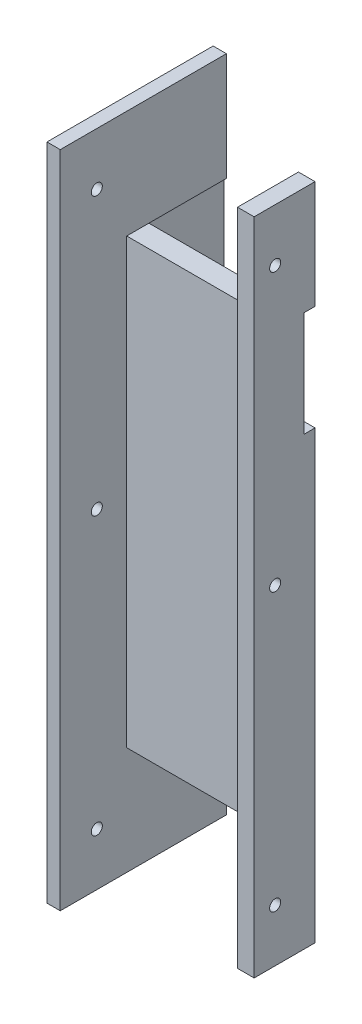
ISO-10303-21;
HEADER;
FILE_DESCRIPTION(('STEP AP214'),'2;1');
FILE_NAME('part.step','',(''),(''),'','','');
FILE_SCHEMA(('AUTOMOTIVE_DESIGN { 1 0 10303 214 1 1 1 1 }'));
ENDSEC;
DATA;
#1=APPLICATION_CONTEXT('core data for automotive mechanical design processes');
#2=APPLICATION_PROTOCOL_DEFINITION('international standard','automotive_design',2000,#1);
#3=PRODUCT_CONTEXT('',#1,'mechanical');
#4=PRODUCT('Part','Part','',(#3));
#5=PRODUCT_RELATED_PRODUCT_CATEGORY('part','',(#4));
#6=PRODUCT_DEFINITION_FORMATION('','',#4);
#7=PRODUCT_DEFINITION_CONTEXT('part definition',#1,'design');
#8=PRODUCT_DEFINITION('design','',#6,#7);
#9=PRODUCT_DEFINITION_SHAPE('','',#8);
#10=(LENGTH_UNIT() NAMED_UNIT(*) SI_UNIT(.MILLI.,.METRE.));
#11=(NAMED_UNIT(*) PLANE_ANGLE_UNIT() SI_UNIT($,.RADIAN.));
#12=(NAMED_UNIT(*) SI_UNIT($,.STERADIAN.) SOLID_ANGLE_UNIT());
#13=UNCERTAINTY_MEASURE_WITH_UNIT(LENGTH_MEASURE(1.E-05),#10,'distance_accuracy_value','');
#14=(GEOMETRIC_REPRESENTATION_CONTEXT(3) GLOBAL_UNCERTAINTY_ASSIGNED_CONTEXT((#13)) GLOBAL_UNIT_ASSIGNED_CONTEXT((#10,
#11,#12)) REPRESENTATION_CONTEXT('',''));
#15=CARTESIAN_POINT('',(0.,0.,0.));
#16=DIRECTION('',(0.,0.,1.));
#17=DIRECTION('',(1.,0.,0.));
#18=AXIS2_PLACEMENT_3D('',#15,#16,#17);
#19=CARTESIAN_POINT('',(1.5,-29.75,-1.50000000000001));
#20=DIRECTION('',(0.,0.,1.));
#21=DIRECTION('',(0.,-1.,0.));
#22=AXIS2_PLACEMENT_3D('',#19,#20,#21);
#23=PLANE('',#22);
#24=DIRECTION('',(0.,-1.,0.));
#25=VECTOR('',#24,1.);
#26=CARTESIAN_POINT('',(-12.5,-20.,-1.5));
#27=LINE('',#26,#25);
#28=CARTESIAN_POINT('',(-12.5,10.5,-1.5));
#29=VERTEX_POINT('',#28);
#30=CARTESIAN_POINT('',(-12.5,-20.,-1.5));
#31=VERTEX_POINT('',#30);
#32=EDGE_CURVE('E304',#29,#31,#27,.T.);
#33=ORIENTED_EDGE('',*,*,#32,.F.);
#34=DIRECTION('',(-1.,0.,0.));
#35=VECTOR('',#34,1.);
#36=CARTESIAN_POINT('',(-12.5,10.5,-1.5));
#37=LINE('',#36,#35);
#38=CARTESIAN_POINT('',(1.5,10.5,-1.5));
#39=VERTEX_POINT('',#38);
#40=EDGE_CURVE('E239',#39,#29,#37,.T.);
#41=ORIENTED_EDGE('',*,*,#40,.F.);
#42=DIRECTION('',(0.,1.,0.));
#43=VECTOR('',#42,1.);
#44=CARTESIAN_POINT('',(1.5,-29.75,-1.50000000000001));
#45=LINE('',#44,#43);
#46=CARTESIAN_POINT('',(1.5,-29.75,-1.50000000000001));
#47=VERTEX_POINT('',#46);
#48=EDGE_CURVE('E329',#47,#39,#45,.T.);
#49=ORIENTED_EDGE('',*,*,#48,.F.);
#50=DIRECTION('',(-1.,0.,0.));
#51=VECTOR('',#50,1.);
#52=CARTESIAN_POINT('',(1.5,-29.75,-1.50000000000001));
#53=LINE('',#52,#51);
#54=CARTESIAN_POINT('',(0.,-29.75,-1.50000000000001));
#55=VERTEX_POINT('',#54);
#56=EDGE_CURVE('E343',#47,#55,#53,.T.);
#57=ORIENTED_EDGE('',*,*,#56,.T.);
#58=DIRECTION('',(0.,1.,0.));
#59=VECTOR('',#58,1.);
#60=CARTESIAN_POINT('',(0.,-29.75,-1.50000000000001));
#61=LINE('',#60,#59);
#62=CARTESIAN_POINT('',(0.,-20.,-1.5));
#63=VERTEX_POINT('',#62);
#64=EDGE_CURVE('E344',#55,#63,#61,.T.);
#65=ORIENTED_EDGE('',*,*,#64,.T.);
#66=DIRECTION('',(1.,0.,0.));
#67=VECTOR('',#66,1.);
#68=CARTESIAN_POINT('',(-12.5,-20.,-1.5));
#69=LINE('',#68,#67);
#70=EDGE_CURVE('E321',#31,#63,#69,.T.);
#71=ORIENTED_EDGE('',*,*,#70,.F.);
#72=EDGE_LOOP('',(#33,#41,#49,#57,#65,#71));
#73=FACE_BOUND('',#72,.T.);
#74=ADVANCED_FACE('F47',(#73),#23,.F.);
#75=CARTESIAN_POINT('',(1.5,20.,-1.5));
#76=VERTEX_POINT('',#75);
#77=CARTESIAN_POINT('',(1.5,29.75,-1.49999999999999));
#78=VERTEX_POINT('',#77);
#79=EDGE_CURVE('E334',#76,#78,#45,.T.);
#80=ORIENTED_EDGE('',*,*,#79,.F.);
#81=DIRECTION('',(1.,0.,0.));
#82=VECTOR('',#81,1.);
#83=CARTESIAN_POINT('',(-12.5,20.,-1.5));
#84=LINE('',#83,#82);
#85=CARTESIAN_POINT('',(0.,20.,-1.5));
#86=VERTEX_POINT('',#85);
#87=EDGE_CURVE('E224',#86,#76,#84,.T.);
#88=ORIENTED_EDGE('',*,*,#87,.F.);
#89=CARTESIAN_POINT('',(0.,29.75,-1.49999999999999));
#90=VERTEX_POINT('',#89);
#91=EDGE_CURVE('E328',#86,#90,#61,.T.);
#92=ORIENTED_EDGE('',*,*,#91,.T.);
#93=DIRECTION('',(-1.,0.,0.));
#94=VECTOR('',#93,1.);
#95=CARTESIAN_POINT('',(1.5,29.75,-1.49999999999999));
#96=LINE('',#95,#94);
#97=EDGE_CURVE('E11',#78,#90,#96,.T.);
#98=ORIENTED_EDGE('',*,*,#97,.F.);
#99=EDGE_LOOP('',(#80,#88,#92,#98));
#100=FACE_BOUND('',#99,.T.);
#101=ADVANCED_FACE('F49',(#100),#23,.F.);
#102=CARTESIAN_POINT('',(1.5,29.75,4.00000000000001));
#103=DIRECTION('',(0.,-1.,0.));
#104=DIRECTION('',(0.,0.,-1.));
#105=AXIS2_PLACEMENT_3D('',#102,#103,#104);
#106=PLANE('',#105);
#107=DIRECTION('',(0.,0.,1.));
#108=VECTOR('',#107,1.);
#109=CARTESIAN_POINT('',(0.,29.75,4.00000000000001));
#110=LINE('',#109,#108);
#111=CARTESIAN_POINT('',(0.,29.75,4.00000000000001));
#112=VERTEX_POINT('',#111);
#113=EDGE_CURVE('E348',#90,#112,#110,.T.);
#114=ORIENTED_EDGE('',*,*,#113,.T.);
#115=DIRECTION('',(-1.,0.,0.));
#116=VECTOR('',#115,1.);
#117=CARTESIAN_POINT('',(1.5,29.75,4.00000000000001));
#118=LINE('',#117,#116);
#119=CARTESIAN_POINT('',(1.5,29.75,4.00000000000001));
#120=VERTEX_POINT('',#119);
#121=EDGE_CURVE('E57',#120,#112,#118,.T.);
#122=ORIENTED_EDGE('',*,*,#121,.F.);
#123=DIRECTION('',(0.,0.,1.));
#124=VECTOR('',#123,1.);
#125=CARTESIAN_POINT('',(1.5,29.75,4.00000000000001));
#126=LINE('',#125,#124);
#127=EDGE_CURVE('E333',#78,#120,#126,.T.);
#128=ORIENTED_EDGE('',*,*,#127,.F.);
#129=ORIENTED_EDGE('',*,*,#97,.T.);
#130=EDGE_LOOP('',(#114,#122,#128,#129));
#131=FACE_BOUND('',#130,.T.);
#132=ADVANCED_FACE('F448',(#131),#106,.F.);
#133=CARTESIAN_POINT('',(1.5,-29.75,3.99999999999999));
#134=DIRECTION('',(0.,0.,-1.));
#135=DIRECTION('',(0.,1.,0.));
#136=AXIS2_PLACEMENT_3D('',#133,#134,#135);
#137=PLANE('',#136);
#138=DIRECTION('',(0.,-1.,0.));
#139=VECTOR('',#138,1.);
#140=CARTESIAN_POINT('',(0.,-29.75,3.99999999999999));
#141=LINE('',#140,#139);
#142=CARTESIAN_POINT('',(0.,-29.75,3.99999999999999));
#143=VERTEX_POINT('',#142);
#144=EDGE_CURVE('E351',#112,#143,#141,.T.);
#145=ORIENTED_EDGE('',*,*,#144,.T.);
#146=DIRECTION('',(-1.,0.,0.));
#147=VECTOR('',#146,1.);
#148=CARTESIAN_POINT('',(1.5,-29.75,3.99999999999999));
#149=LINE('',#148,#147);
#150=CARTESIAN_POINT('',(1.5,-29.75,3.99999999999999));
#151=VERTEX_POINT('',#150);
#152=EDGE_CURVE('E360',#151,#143,#149,.T.);
#153=ORIENTED_EDGE('',*,*,#152,.F.);
#154=DIRECTION('',(0.,-1.,0.));
#155=VECTOR('',#154,1.);
#156=CARTESIAN_POINT('',(1.5,-29.75,3.99999999999999));
#157=LINE('',#156,#155);
#158=EDGE_CURVE('E337',#120,#151,#157,.T.);
#159=ORIENTED_EDGE('',*,*,#158,.F.);
#160=ORIENTED_EDGE('',*,*,#121,.T.);
#161=EDGE_LOOP('',(#145,#153,#159,#160));
#162=FACE_BOUND('',#161,.T.);
#163=ADVANCED_FACE('F716',(#162),#137,.F.);
#164=CARTESIAN_POINT('',(1.5,-29.75,3.99999999999999));
#165=DIRECTION('',(0.,1.,0.));
#166=DIRECTION('',(0.,0.,1.));
#167=AXIS2_PLACEMENT_3D('',#164,#165,#166);
#168=PLANE('',#167);
#169=DIRECTION('',(0.,0.,-1.));
#170=VECTOR('',#169,1.);
#171=CARTESIAN_POINT('',(0.,-29.75,3.99999999999999));
#172=LINE('',#171,#170);
#173=EDGE_CURVE('E354',#143,#55,#172,.T.);
#174=ORIENTED_EDGE('',*,*,#173,.T.);
#175=ORIENTED_EDGE('',*,*,#56,.F.);
#176=DIRECTION('',(0.,0.,-1.));
#177=VECTOR('',#176,1.);
#178=CARTESIAN_POINT('',(1.5,-29.75,3.99999999999999));
#179=LINE('',#178,#177);
#180=EDGE_CURVE('E340',#151,#47,#179,.T.);
#181=ORIENTED_EDGE('',*,*,#180,.F.);
#182=ORIENTED_EDGE('',*,*,#152,.T.);
#183=EDGE_LOOP('',(#174,#175,#181,#182));
#184=FACE_BOUND('',#183,.T.);
#185=ADVANCED_FACE('F709',(#184),#168,.F.);
#186=CARTESIAN_POINT('',(1.5,0.,0.));
#187=DIRECTION('',(-1.,0.,0.));
#188=DIRECTION('',(0.,0.,1.));
#189=AXIS2_PLACEMENT_3D('',#186,#187,#188);
#190=PLANE('',#189);
#191=CARTESIAN_POINT('',(1.5,-25.,2.09999999999999));
#192=DIRECTION('',(1.,0.,0.));
#193=DIRECTION('',(0.,0.,-1.));
#194=AXIS2_PLACEMENT_3D('',#191,#192,#193);
#195=CIRCLE('',#194,0.5);
#196=CARTESIAN_POINT('',(1.5,-25.,1.59999999999999));
#197=VERTEX_POINT('',#196);
#198=EDGE_CURVE('E371',#197,#197,#195,.T.);
#199=ORIENTED_EDGE('',*,*,#198,.F.);
#200=EDGE_LOOP('',(#199));
#201=FACE_BOUND('',#200,.T.);
#202=CARTESIAN_POINT('',(1.5,0.,2.10000000000007));
#203=DIRECTION('',(1.,0.,0.));
#204=DIRECTION('',(0.,0.,-1.));
#205=AXIS2_PLACEMENT_3D('',#202,#203,#204);
#206=CIRCLE('',#205,0.5);
#207=CARTESIAN_POINT('',(1.5,0.,1.60000000000007));
#208=VERTEX_POINT('',#207);
#209=EDGE_CURVE('E613',#208,#208,#206,.T.);
#210=ORIENTED_EDGE('',*,*,#209,.F.);
#211=EDGE_LOOP('',(#210));
#212=FACE_BOUND('',#211,.T.);
#213=CARTESIAN_POINT('',(1.5,25.,2.10000000000016));
#214=DIRECTION('',(1.,0.,0.));
#215=DIRECTION('',(0.,0.,-1.));
#216=AXIS2_PLACEMENT_3D('',#213,#214,#215);
#217=CIRCLE('',#216,0.5);
#218=CARTESIAN_POINT('',(1.5,25.,1.60000000000016));
#219=VERTEX_POINT('',#218);
#220=EDGE_CURVE('E621',#219,#219,#217,.T.);
#221=ORIENTED_EDGE('',*,*,#220,.F.);
#222=EDGE_LOOP('',(#221));
#223=FACE_BOUND('',#222,.T.);
#224=ORIENTED_EDGE('',*,*,#48,.T.);
#225=DIRECTION('',(0.,0.,-1.));
#226=VECTOR('',#225,1.);
#227=CARTESIAN_POINT('',(1.5,10.5,-0.499999999999997));
#228=LINE('',#227,#226);
#229=CARTESIAN_POINT('',(1.5,10.5,-0.499999999999997));
#230=VERTEX_POINT('',#229);
#231=EDGE_CURVE('E242',#230,#39,#228,.T.);
#232=ORIENTED_EDGE('',*,*,#231,.F.);
#233=DIRECTION('',(0.,-1.,0.));
#234=VECTOR('',#233,1.);
#235=CARTESIAN_POINT('',(1.5,20.,-0.499999999999996));
#236=LINE('',#235,#234);
#237=CARTESIAN_POINT('',(1.5,20.,-0.499999999999996));
#238=VERTEX_POINT('',#237);
#239=EDGE_CURVE('E183',#238,#230,#236,.T.);
#240=ORIENTED_EDGE('',*,*,#239,.F.);
#241=DIRECTION('',(0.,0.,-1.));
#242=VECTOR('',#241,1.);
#243=CARTESIAN_POINT('',(1.5,20.,-0.499999999999996));
#244=LINE('',#243,#242);
#245=EDGE_CURVE('E187',#238,#76,#244,.T.);
#246=ORIENTED_EDGE('',*,*,#245,.T.);
#247=ORIENTED_EDGE('',*,*,#79,.T.);
#248=ORIENTED_EDGE('',*,*,#127,.T.);
#249=ORIENTED_EDGE('',*,*,#158,.T.);
#250=ORIENTED_EDGE('',*,*,#180,.T.);
#251=EDGE_LOOP('',(#224,#232,#240,#246,#247,#248,#249,#250));
#252=FACE_BOUND('',#251,.T.);
#253=ADVANCED_FACE('F461',(#201,#212,#223,#252),#190,.F.);
#254=CARTESIAN_POINT('',(0.,0.,0.));
#255=DIRECTION('',(-1.,0.,0.));
#256=DIRECTION('',(0.,0.,1.));
#257=AXIS2_PLACEMENT_3D('',#254,#255,#256);
#258=PLANE('',#257);
#259=CARTESIAN_POINT('',(0.,-25.,2.09999999999999));
#260=DIRECTION('',(-1.,0.,0.));
#261=DIRECTION('',(0.,0.,1.));
#262=AXIS2_PLACEMENT_3D('',#259,#260,#261);
#263=CIRCLE('',#262,0.5);
#264=CARTESIAN_POINT('',(0.,-25.,2.59999999999999));
#265=VERTEX_POINT('',#264);
#266=EDGE_CURVE('E51',#265,#265,#263,.T.);
#267=ORIENTED_EDGE('',*,*,#266,.F.);
#268=EDGE_LOOP('',(#267));
#269=FACE_BOUND('',#268,.T.);
#270=CARTESIAN_POINT('',(0.,0.,2.10000000000007));
#271=DIRECTION('',(-1.,0.,0.));
#272=DIRECTION('',(0.,0.,1.));
#273=AXIS2_PLACEMENT_3D('',#270,#271,#272);
#274=CIRCLE('',#273,0.5);
#275=CARTESIAN_POINT('',(0.,0.,2.60000000000007));
#276=VERTEX_POINT('',#275);
#277=EDGE_CURVE('E370',#276,#276,#274,.T.);
#278=ORIENTED_EDGE('',*,*,#277,.F.);
#279=EDGE_LOOP('',(#278));
#280=FACE_BOUND('',#279,.T.);
#281=CARTESIAN_POINT('',(0.,25.,2.10000000000016));
#282=DIRECTION('',(-1.,0.,0.));
#283=DIRECTION('',(0.,0.,1.));
#284=AXIS2_PLACEMENT_3D('',#281,#282,#283);
#285=CIRCLE('',#284,0.5);
#286=CARTESIAN_POINT('',(0.,25.,2.60000000000016));
#287=VERTEX_POINT('',#286);
#288=EDGE_CURVE('E367',#287,#287,#285,.T.);
#289=ORIENTED_EDGE('',*,*,#288,.F.);
#290=EDGE_LOOP('',(#289));
#291=FACE_BOUND('',#290,.T.);
#292=DIRECTION('',(0.,0.,1.));
#293=VECTOR('',#292,1.);
#294=CARTESIAN_POINT('',(0.,-20.,-1.5));
#295=LINE('',#294,#293);
#296=CARTESIAN_POINT('',(0.,-20.,1.5));
#297=VERTEX_POINT('',#296);
#298=EDGE_CURVE('E300',#63,#297,#295,.T.);
#299=ORIENTED_EDGE('',*,*,#298,.F.);
#300=ORIENTED_EDGE('',*,*,#64,.F.);
#301=ORIENTED_EDGE('',*,*,#173,.F.);
#302=ORIENTED_EDGE('',*,*,#144,.F.);
#303=ORIENTED_EDGE('',*,*,#113,.F.);
#304=ORIENTED_EDGE('',*,*,#91,.F.);
#305=DIRECTION('',(0.,0.,-1.));
#306=VECTOR('',#305,1.);
#307=CARTESIAN_POINT('',(0.,20.,0.));
#308=LINE('',#307,#306);
#309=CARTESIAN_POINT('',(0.,20.,-0.499999999999996));
#310=VERTEX_POINT('',#309);
#311=EDGE_CURVE('E245',#310,#86,#308,.T.);
#312=ORIENTED_EDGE('',*,*,#311,.F.);
#313=DIRECTION('',(0.,0.,-1.));
#314=VECTOR('',#313,1.);
#315=CARTESIAN_POINT('',(0.,20.,-1.5));
#316=LINE('',#315,#314);
#317=CARTESIAN_POINT('',(0.,20.,1.5));
#318=VERTEX_POINT('',#317);
#319=EDGE_CURVE('E70',#318,#310,#316,.T.);
#320=ORIENTED_EDGE('',*,*,#319,.F.);
#321=DIRECTION('',(0.,1.,0.));
#322=VECTOR('',#321,1.);
#323=CARTESIAN_POINT('',(0.,-20.,1.5));
#324=LINE('',#323,#322);
#325=EDGE_CURVE('E65',#297,#318,#324,.T.);
#326=ORIENTED_EDGE('',*,*,#325,.F.);
#327=EDGE_LOOP('',(#299,#300,#301,#302,#303,#304,#312,#320,#326));
#328=FACE_BOUND('',#327,.T.);
#329=ADVANCED_FACE('F467',(#269,#280,#291,#328),#258,.T.);
#330=CARTESIAN_POINT('',(-12.5,-20.,1.5));
#331=DIRECTION('',(0.,0.,-1.));
#332=DIRECTION('',(-1.,0.,0.));
#333=AXIS2_PLACEMENT_3D('',#330,#331,#332);
#334=PLANE('',#333);
#335=ORIENTED_EDGE('',*,*,#325,.T.);
#336=DIRECTION('',(1.,0.,0.));
#337=VECTOR('',#336,1.);
#338=CARTESIAN_POINT('',(-12.5,20.,1.5));
#339=LINE('',#338,#337);
#340=CARTESIAN_POINT('',(-12.5,20.,1.5));
#341=VERTEX_POINT('',#340);
#342=EDGE_CURVE('E325',#341,#318,#339,.T.);
#343=ORIENTED_EDGE('',*,*,#342,.F.);
#344=DIRECTION('',(0.,1.,0.));
#345=VECTOR('',#344,1.);
#346=CARTESIAN_POINT('',(-12.5,-20.,1.5));
#347=LINE('',#346,#345);
#348=CARTESIAN_POINT('',(-12.5,-20.,1.5));
#349=VERTEX_POINT('',#348);
#350=EDGE_CURVE('E295',#349,#341,#347,.T.);
#351=ORIENTED_EDGE('',*,*,#350,.F.);
#352=DIRECTION('',(1.,0.,0.));
#353=VECTOR('',#352,1.);
#354=CARTESIAN_POINT('',(-12.5,-20.,1.5));
#355=LINE('',#354,#353);
#356=EDGE_CURVE('E311',#349,#297,#355,.T.);
#357=ORIENTED_EDGE('',*,*,#356,.T.);
#358=EDGE_LOOP('',(#335,#343,#351,#357));
#359=FACE_BOUND('',#358,.T.);
#360=ADVANCED_FACE('F473',(#359),#334,.F.);
#361=CARTESIAN_POINT('',(-12.5,20.,-1.5));
#362=DIRECTION('',(0.,-1.,0.));
#363=DIRECTION('',(0.,0.,-1.));
#364=AXIS2_PLACEMENT_3D('',#361,#362,#363);
#365=PLANE('',#364);
#366=ORIENTED_EDGE('',*,*,#319,.T.);
#367=DIRECTION('',(1.,0.,0.));
#368=VECTOR('',#367,1.);
#369=CARTESIAN_POINT('',(-12.5,20.,-0.499999999999996));
#370=LINE('',#369,#368);
#371=CARTESIAN_POINT('',(-12.5,20.,-0.499999999999996));
#372=VERTEX_POINT('',#371);
#373=EDGE_CURVE('E230',#372,#310,#370,.T.);
#374=ORIENTED_EDGE('',*,*,#373,.F.);
#375=DIRECTION('',(0.,0.,-1.));
#376=VECTOR('',#375,1.);
#377=CARTESIAN_POINT('',(-12.5,20.,-1.5));
#378=LINE('',#377,#376);
#379=EDGE_CURVE('E299',#341,#372,#378,.T.);
#380=ORIENTED_EDGE('',*,*,#379,.F.);
#381=ORIENTED_EDGE('',*,*,#342,.T.);
#382=EDGE_LOOP('',(#366,#374,#380,#381));
#383=FACE_BOUND('',#382,.T.);
#384=ADVANCED_FACE('F478',(#383),#365,.F.);
#385=CARTESIAN_POINT('',(-12.5,-20.,-1.5));
#386=DIRECTION('',(0.,1.,0.));
#387=DIRECTION('',(0.,0.,1.));
#388=AXIS2_PLACEMENT_3D('',#385,#386,#387);
#389=PLANE('',#388);
#390=ORIENTED_EDGE('',*,*,#298,.T.);
#391=ORIENTED_EDGE('',*,*,#356,.F.);
#392=DIRECTION('',(0.,0.,1.));
#393=VECTOR('',#392,1.);
#394=CARTESIAN_POINT('',(-12.5,-20.,-1.5));
#395=LINE('',#394,#393);
#396=EDGE_CURVE('E307',#31,#349,#395,.T.);
#397=ORIENTED_EDGE('',*,*,#396,.F.);
#398=ORIENTED_EDGE('',*,*,#70,.T.);
#399=EDGE_LOOP('',(#390,#391,#397,#398));
#400=FACE_BOUND('',#399,.T.);
#401=ADVANCED_FACE('F471',(#400),#389,.F.);
#402=CARTESIAN_POINT('',(-13.7,-29.75,7.5));
#403=DIRECTION('',(0.,0.,-1.));
#404=DIRECTION('',(-1.,0.,0.));
#405=AXIS2_PLACEMENT_3D('',#402,#403,#404);
#406=PLANE('',#405);
#407=DIRECTION('',(0.,1.,0.));
#408=VECTOR('',#407,1.);
#409=CARTESIAN_POINT('',(-12.5,-29.75,7.5));
#410=LINE('',#409,#408);
#411=CARTESIAN_POINT('',(-12.5,-29.75,7.5));
#412=VERTEX_POINT('',#411);
#413=CARTESIAN_POINT('',(-12.5,29.75,7.5));
#414=VERTEX_POINT('',#413);
#415=EDGE_CURVE('E251',#412,#414,#410,.T.);
#416=ORIENTED_EDGE('',*,*,#415,.T.);
#417=DIRECTION('',(1.,0.,0.));
#418=VECTOR('',#417,1.);
#419=CARTESIAN_POINT('',(-13.7,29.75,7.5));
#420=LINE('',#419,#418);
#421=CARTESIAN_POINT('',(-13.7,29.75,7.5));
#422=VERTEX_POINT('',#421);
#423=EDGE_CURVE('E291',#422,#414,#420,.T.);
#424=ORIENTED_EDGE('',*,*,#423,.F.);
#425=DIRECTION('',(0.,1.,0.));
#426=VECTOR('',#425,1.);
#427=CARTESIAN_POINT('',(-13.7,-29.75,7.5));
#428=LINE('',#427,#426);
#429=CARTESIAN_POINT('',(-13.7,-29.75,7.5));
#430=VERTEX_POINT('',#429);
#431=EDGE_CURVE('E252',#430,#422,#428,.T.);
#432=ORIENTED_EDGE('',*,*,#431,.F.);
#433=DIRECTION('',(1.,0.,0.));
#434=VECTOR('',#433,1.);
#435=CARTESIAN_POINT('',(-13.7,-29.75,7.5));
#436=LINE('',#435,#434);
#437=EDGE_CURVE('E266',#430,#412,#436,.T.);
#438=ORIENTED_EDGE('',*,*,#437,.T.);
#439=EDGE_LOOP('',(#416,#424,#432,#438));
#440=FACE_BOUND('',#439,.T.);
#441=ADVANCED_FACE('F667',(#440),#406,.F.);
#442=CARTESIAN_POINT('',(-13.7,29.75,-7.5));
#443=DIRECTION('',(0.,-1.,0.));
#444=DIRECTION('',(0.,0.,-1.));
#445=AXIS2_PLACEMENT_3D('',#442,#443,#444);
#446=PLANE('',#445);
#447=DIRECTION('',(0.,0.,-1.));
#448=VECTOR('',#447,1.);
#449=CARTESIAN_POINT('',(-12.5,29.75,-7.5));
#450=LINE('',#449,#448);
#451=CARTESIAN_POINT('',(-12.5,29.75,-7.5));
#452=VERTEX_POINT('',#451);
#453=EDGE_CURVE('E270',#414,#452,#450,.T.);
#454=ORIENTED_EDGE('',*,*,#453,.T.);
#455=DIRECTION('',(1.,0.,0.));
#456=VECTOR('',#455,1.);
#457=CARTESIAN_POINT('',(-13.7,29.75,-7.5));
#458=LINE('',#457,#456);
#459=CARTESIAN_POINT('',(-13.7,29.75,-7.5));
#460=VERTEX_POINT('',#459);
#461=EDGE_CURVE('E287',#460,#452,#458,.T.);
#462=ORIENTED_EDGE('',*,*,#461,.F.);
#463=DIRECTION('',(0.,0.,-1.));
#464=VECTOR('',#463,1.);
#465=CARTESIAN_POINT('',(-13.7,29.75,-7.5));
#466=LINE('',#465,#464);
#467=EDGE_CURVE('E256',#422,#460,#466,.T.);
#468=ORIENTED_EDGE('',*,*,#467,.F.);
#469=ORIENTED_EDGE('',*,*,#423,.T.);
#470=EDGE_LOOP('',(#454,#462,#468,#469));
#471=FACE_BOUND('',#470,.T.);
#472=ADVANCED_FACE('F670',(#471),#446,.F.);
#473=CARTESIAN_POINT('',(-13.7,-29.75,-7.5));
#474=DIRECTION('',(0.,0.,1.));
#475=DIRECTION('',(1.,0.,0.));
#476=AXIS2_PLACEMENT_3D('',#473,#474,#475);
#477=PLANE('',#476);
#478=DIRECTION('',(0.,-1.,0.));
#479=VECTOR('',#478,1.);
#480=CARTESIAN_POINT('',(-12.5,-29.75,-7.5));
#481=LINE('',#480,#479);
#482=CARTESIAN_POINT('',(-12.5,20.,-7.5));
#483=VERTEX_POINT('',#482);
#484=EDGE_CURVE('E274',#452,#483,#481,.T.);
#485=ORIENTED_EDGE('',*,*,#484,.T.);
#486=DIRECTION('',(1.,0.,0.));
#487=VECTOR('',#486,1.);
#488=CARTESIAN_POINT('',(-12.7,20.,-7.5));
#489=LINE('',#488,#487);
#490=CARTESIAN_POINT('',(-12.7,20.,-7.5));
#491=VERTEX_POINT('',#490);
#492=EDGE_CURVE('E225',#491,#483,#489,.T.);
#493=ORIENTED_EDGE('',*,*,#492,.F.);
#494=DIRECTION('',(0.,1.,0.));
#495=VECTOR('',#494,1.);
#496=CARTESIAN_POINT('',(-12.7,10.5,-7.5));
#497=LINE('',#496,#495);
#498=CARTESIAN_POINT('',(-12.7,10.5,-7.5));
#499=VERTEX_POINT('',#498);
#500=EDGE_CURVE('E198',#499,#491,#497,.T.);
#501=ORIENTED_EDGE('',*,*,#500,.F.);
#502=DIRECTION('',(1.,0.,0.));
#503=VECTOR('',#502,1.);
#504=CARTESIAN_POINT('',(-12.7,10.5,-7.5));
#505=LINE('',#504,#503);
#506=CARTESIAN_POINT('',(-12.5,10.5,-7.5));
#507=VERTEX_POINT('',#506);
#508=EDGE_CURVE('E194',#499,#507,#505,.T.);
#509=ORIENTED_EDGE('',*,*,#508,.T.);
#510=CARTESIAN_POINT('',(-12.5,-29.75,-7.5));
#511=VERTEX_POINT('',#510);
#512=EDGE_CURVE('E273',#507,#511,#481,.T.);
#513=ORIENTED_EDGE('',*,*,#512,.T.);
#514=DIRECTION('',(1.,0.,0.));
#515=VECTOR('',#514,1.);
#516=CARTESIAN_POINT('',(-13.7,-29.75,-7.5));
#517=LINE('',#516,#515);
#518=CARTESIAN_POINT('',(-13.7,-29.75,-7.5));
#519=VERTEX_POINT('',#518);
#520=EDGE_CURVE('E283',#519,#511,#517,.T.);
#521=ORIENTED_EDGE('',*,*,#520,.F.);
#522=DIRECTION('',(0.,-1.,0.));
#523=VECTOR('',#522,1.);
#524=CARTESIAN_POINT('',(-13.7,-29.75,-7.5));
#525=LINE('',#524,#523);
#526=EDGE_CURVE('E260',#460,#519,#525,.T.);
#527=ORIENTED_EDGE('',*,*,#526,.F.);
#528=ORIENTED_EDGE('',*,*,#461,.T.);
#529=EDGE_LOOP('',(#485,#493,#501,#509,#513,#521,#527,#528));
#530=FACE_BOUND('',#529,.T.);
#531=ADVANCED_FACE('F674',(#530),#477,.F.);
#532=CARTESIAN_POINT('',(-13.7,-29.75,-7.5));
#533=DIRECTION('',(0.,1.,0.));
#534=DIRECTION('',(0.,0.,1.));
#535=AXIS2_PLACEMENT_3D('',#532,#533,#534);
#536=PLANE('',#535);
#537=DIRECTION('',(0.,0.,1.));
#538=VECTOR('',#537,1.);
#539=CARTESIAN_POINT('',(-12.5,-29.75,-7.5));
#540=LINE('',#539,#538);
#541=EDGE_CURVE('E257',#511,#412,#540,.T.);
#542=ORIENTED_EDGE('',*,*,#541,.T.);
#543=ORIENTED_EDGE('',*,*,#437,.F.);
#544=DIRECTION('',(0.,0.,1.));
#545=VECTOR('',#544,1.);
#546=CARTESIAN_POINT('',(-13.7,-29.75,-7.5));
#547=LINE('',#546,#545);
#548=EDGE_CURVE('E263',#519,#430,#547,.T.);
#549=ORIENTED_EDGE('',*,*,#548,.F.);
#550=ORIENTED_EDGE('',*,*,#520,.T.);
#551=EDGE_LOOP('',(#542,#543,#549,#550));
#552=FACE_BOUND('',#551,.T.);
#553=ADVANCED_FACE('F657',(#552),#536,.F.);
#554=CARTESIAN_POINT('',(-13.7,0.,0.));
#555=DIRECTION('',(1.,0.,0.));
#556=DIRECTION('',(0.,0.,-1.));
#557=AXIS2_PLACEMENT_3D('',#554,#555,#556);
#558=PLANE('',#557);
#559=CARTESIAN_POINT('',(-13.7,-25.,4.2));
#560=DIRECTION('',(1.,0.,0.));
#561=DIRECTION('',(0.,0.,-1.));
#562=AXIS2_PLACEMENT_3D('',#559,#560,#561);
#563=CIRCLE('',#562,0.500000000000001);
#564=CARTESIAN_POINT('',(-13.7,-25.,3.7));
#565=VERTEX_POINT('',#564);
#566=EDGE_CURVE('E212',#565,#565,#563,.T.);
#567=ORIENTED_EDGE('',*,*,#566,.T.);
#568=EDGE_LOOP('',(#567));
#569=FACE_BOUND('',#568,.T.);
#570=CARTESIAN_POINT('',(-13.7,-16.5,-3.8));
#571=DIRECTION('',(1.,0.,0.));
#572=DIRECTION('',(0.,0.,-1.));
#573=AXIS2_PLACEMENT_3D('',#570,#571,#572);
#574=CIRCLE('',#573,0.500000000000001);
#575=CARTESIAN_POINT('',(-13.7,-16.5,-4.3));
#576=VERTEX_POINT('',#575);
#577=EDGE_CURVE('E411',#576,#576,#574,.T.);
#578=ORIENTED_EDGE('',*,*,#577,.T.);
#579=EDGE_LOOP('',(#578));
#580=FACE_BOUND('',#579,.T.);
#581=CARTESIAN_POINT('',(-13.7,0.,4.20000000000009));
#582=DIRECTION('',(1.,0.,0.));
#583=DIRECTION('',(0.,0.,-1.));
#584=AXIS2_PLACEMENT_3D('',#581,#582,#583);
#585=CIRCLE('',#584,0.500000000000001);
#586=CARTESIAN_POINT('',(-13.7,0.,3.70000000000008));
#587=VERTEX_POINT('',#586);
#588=EDGE_CURVE('E408',#587,#587,#585,.T.);
#589=ORIENTED_EDGE('',*,*,#588,.T.);
#590=EDGE_LOOP('',(#589));
#591=FACE_BOUND('',#590,.T.);
#592=CARTESIAN_POINT('',(-13.7,25.,4.20000000000017));
#593=DIRECTION('',(1.,0.,0.));
#594=DIRECTION('',(0.,0.,-1.));
#595=AXIS2_PLACEMENT_3D('',#592,#593,#594);
#596=CIRCLE('',#595,0.500000000000001);
#597=CARTESIAN_POINT('',(-13.7,25.,3.70000000000017));
#598=VERTEX_POINT('',#597);
#599=EDGE_CURVE('E403',#598,#598,#596,.T.);
#600=ORIENTED_EDGE('',*,*,#599,.T.);
#601=EDGE_LOOP('',(#600));
#602=FACE_BOUND('',#601,.T.);
#603=CARTESIAN_POINT('',(-13.7,7.5,-3.79999999999992));
#604=DIRECTION('',(1.,0.,0.));
#605=DIRECTION('',(0.,0.,-1.));
#606=AXIS2_PLACEMENT_3D('',#603,#604,#605);
#607=CIRCLE('',#606,0.500000000000001);
#608=CARTESIAN_POINT('',(-13.7,7.5,-4.29999999999992));
#609=VERTEX_POINT('',#608);
#610=EDGE_CURVE('E399',#609,#609,#607,.T.);
#611=ORIENTED_EDGE('',*,*,#610,.T.);
#612=EDGE_LOOP('',(#611));
#613=FACE_BOUND('',#612,.T.);
#614=ORIENTED_EDGE('',*,*,#431,.T.);
#615=ORIENTED_EDGE('',*,*,#467,.T.);
#616=ORIENTED_EDGE('',*,*,#526,.T.);
#617=ORIENTED_EDGE('',*,*,#548,.T.);
#618=EDGE_LOOP('',(#614,#615,#616,#617));
#619=FACE_BOUND('',#618,.T.);
#620=ADVANCED_FACE('F424',(#569,#580,#591,#602,#613,#619),#558,.F.);
#621=CARTESIAN_POINT('',(-12.5,0.,0.));
#622=DIRECTION('',(1.,0.,0.));
#623=DIRECTION('',(0.,0.,-1.));
#624=AXIS2_PLACEMENT_3D('',#621,#622,#623);
#625=PLANE('',#624);
#626=CARTESIAN_POINT('',(-12.5,-25.,4.2));
#627=DIRECTION('',(1.,0.,0.));
#628=DIRECTION('',(0.,0.,-1.));
#629=AXIS2_PLACEMENT_3D('',#626,#627,#628);
#630=CIRCLE('',#629,0.500000000000001);
#631=CARTESIAN_POINT('',(-12.5,-25.,3.7));
#632=VERTEX_POINT('',#631);
#633=EDGE_CURVE('E404',#632,#632,#630,.T.);
#634=ORIENTED_EDGE('',*,*,#633,.F.);
#635=EDGE_LOOP('',(#634));
#636=FACE_BOUND('',#635,.T.);
#637=CARTESIAN_POINT('',(-12.5,-16.5,-3.8));
#638=DIRECTION('',(1.,0.,0.));
#639=DIRECTION('',(0.,0.,-1.));
#640=AXIS2_PLACEMENT_3D('',#637,#638,#639);
#641=CIRCLE('',#640,0.500000000000001);
#642=CARTESIAN_POINT('',(-12.5,-16.5,-4.3));
#643=VERTEX_POINT('',#642);
#644=EDGE_CURVE('E631',#643,#643,#641,.T.);
#645=ORIENTED_EDGE('',*,*,#644,.F.);
#646=EDGE_LOOP('',(#645));
#647=FACE_BOUND('',#646,.T.);
#648=CARTESIAN_POINT('',(-12.5,0.,4.20000000000009));
#649=DIRECTION('',(1.,0.,0.));
#650=DIRECTION('',(0.,0.,-1.));
#651=AXIS2_PLACEMENT_3D('',#648,#649,#650);
#652=CIRCLE('',#651,0.500000000000001);
#653=CARTESIAN_POINT('',(-12.5,0.,3.70000000000008));
#654=VERTEX_POINT('',#653);
#655=EDGE_CURVE('E395',#654,#654,#652,.T.);
#656=ORIENTED_EDGE('',*,*,#655,.F.);
#657=EDGE_LOOP('',(#656));
#658=FACE_BOUND('',#657,.T.);
#659=CARTESIAN_POINT('',(-12.5,25.,4.20000000000017));
#660=DIRECTION('',(1.,0.,0.));
#661=DIRECTION('',(0.,0.,-1.));
#662=AXIS2_PLACEMENT_3D('',#659,#660,#661);
#663=CIRCLE('',#662,0.500000000000001);
#664=CARTESIAN_POINT('',(-12.5,25.,3.70000000000017));
#665=VERTEX_POINT('',#664);
#666=EDGE_CURVE('E387',#665,#665,#663,.T.);
#667=ORIENTED_EDGE('',*,*,#666,.F.);
#668=EDGE_LOOP('',(#667));
#669=FACE_BOUND('',#668,.T.);
#670=CARTESIAN_POINT('',(-12.5,7.5,-3.79999999999992));
#671=DIRECTION('',(1.,0.,0.));
#672=DIRECTION('',(0.,0.,-1.));
#673=AXIS2_PLACEMENT_3D('',#670,#671,#672);
#674=CIRCLE('',#673,0.500000000000001);
#675=CARTESIAN_POINT('',(-12.5,7.5,-4.29999999999992));
#676=VERTEX_POINT('',#675);
#677=EDGE_CURVE('E380',#676,#676,#674,.T.);
#678=ORIENTED_EDGE('',*,*,#677,.F.);
#679=EDGE_LOOP('',(#678));
#680=FACE_BOUND('',#679,.T.);
#681=DIRECTION('',(0.,0.,1.));
#682=VECTOR('',#681,1.);
#683=CARTESIAN_POINT('',(-12.5,20.,-0.499999999999997));
#684=LINE('',#683,#682);
#685=EDGE_CURVE('E204',#483,#372,#684,.T.);
#686=ORIENTED_EDGE('',*,*,#685,.F.);
#687=ORIENTED_EDGE('',*,*,#484,.F.);
#688=ORIENTED_EDGE('',*,*,#453,.F.);
#689=ORIENTED_EDGE('',*,*,#415,.F.);
#690=ORIENTED_EDGE('',*,*,#541,.F.);
#691=ORIENTED_EDGE('',*,*,#512,.F.);
#692=DIRECTION('',(0.,0.,-1.));
#693=VECTOR('',#692,1.);
#694=CARTESIAN_POINT('',(-12.5,10.5,-0.499999999999997));
#695=LINE('',#694,#693);
#696=EDGE_CURVE('E209',#29,#507,#695,.T.);
#697=ORIENTED_EDGE('',*,*,#696,.F.);
#698=ORIENTED_EDGE('',*,*,#32,.T.);
#699=ORIENTED_EDGE('',*,*,#396,.T.);
#700=ORIENTED_EDGE('',*,*,#350,.T.);
#701=ORIENTED_EDGE('',*,*,#379,.T.);
#702=EDGE_LOOP('',(#686,#687,#688,#689,#690,#691,#697,#698,#699,#700,#701));
#703=FACE_BOUND('',#702,.T.);
#704=ADVANCED_FACE('F457',(#636,#647,#658,#669,#680,#703),#625,.T.);
#705=CARTESIAN_POINT('',(-12.5,10.5,-0.499999999999997));
#706=DIRECTION('',(0.,-1.,0.));
#707=DIRECTION('',(0.,0.,-1.));
#708=AXIS2_PLACEMENT_3D('',#705,#706,#707);
#709=PLANE('',#708);
#710=ORIENTED_EDGE('',*,*,#40,.T.);
#711=ORIENTED_EDGE('',*,*,#696,.T.);
#712=ORIENTED_EDGE('',*,*,#508,.F.);
#713=DIRECTION('',(0.,0.,-1.));
#714=VECTOR('',#713,1.);
#715=CARTESIAN_POINT('',(-12.7,10.5,-0.499999999999997));
#716=LINE('',#715,#714);
#717=CARTESIAN_POINT('',(-12.7,10.5,-0.499999999999997));
#718=VERTEX_POINT('',#717);
#719=EDGE_CURVE('E190',#718,#499,#716,.T.);
#720=ORIENTED_EDGE('',*,*,#719,.F.);
#721=DIRECTION('',(-1.,0.,0.));
#722=VECTOR('',#721,1.);
#723=CARTESIAN_POINT('',(-12.5,10.5,-0.499999999999997));
#724=LINE('',#723,#722);
#725=EDGE_CURVE('E175',#230,#718,#724,.T.);
#726=ORIENTED_EDGE('',*,*,#725,.F.);
#727=ORIENTED_EDGE('',*,*,#231,.T.);
#728=EDGE_LOOP('',(#710,#711,#712,#720,#726,#727));
#729=FACE_BOUND('',#728,.T.);
#730=ADVANCED_FACE('F192',(#729),#709,.F.);
#731=CARTESIAN_POINT('',(-12.5,20.,-0.499999999999996));
#732=DIRECTION('',(0.,1.,0.));
#733=DIRECTION('',(0.,0.,1.));
#734=AXIS2_PLACEMENT_3D('',#731,#732,#733);
#735=PLANE('',#734);
#736=ORIENTED_EDGE('',*,*,#311,.T.);
#737=ORIENTED_EDGE('',*,*,#87,.T.);
#738=ORIENTED_EDGE('',*,*,#245,.F.);
#739=EDGE_CURVE('E234',#310,#238,#370,.T.);
#740=ORIENTED_EDGE('',*,*,#739,.F.);
#741=EDGE_LOOP('',(#736,#737,#738,#740));
#742=FACE_BOUND('',#741,.T.);
#743=ADVANCED_FACE('F484',(#742),#735,.F.);
#744=CARTESIAN_POINT('',(0.,0.,-0.499999999999999));
#745=DIRECTION('',(0.,0.,1.));
#746=DIRECTION('',(0.,-1.,0.));
#747=AXIS2_PLACEMENT_3D('',#744,#745,#746);
#748=PLANE('',#747);
#749=ORIENTED_EDGE('',*,*,#725,.T.);
#750=DIRECTION('',(0.,-1.,0.));
#751=VECTOR('',#750,1.);
#752=CARTESIAN_POINT('',(-12.7,10.5,-0.499999999999997));
#753=LINE('',#752,#751);
#754=CARTESIAN_POINT('',(-12.7,20.,-0.499999999999997));
#755=VERTEX_POINT('',#754);
#756=EDGE_CURVE('E180',#755,#718,#753,.T.);
#757=ORIENTED_EDGE('',*,*,#756,.F.);
#758=DIRECTION('',(1.,0.,0.));
#759=VECTOR('',#758,1.);
#760=CARTESIAN_POINT('',(-12.7,20.,-0.499999999999997));
#761=LINE('',#760,#759);
#762=EDGE_CURVE('E221',#755,#372,#761,.T.);
#763=ORIENTED_EDGE('',*,*,#762,.T.);
#764=ORIENTED_EDGE('',*,*,#373,.T.);
#765=ORIENTED_EDGE('',*,*,#739,.T.);
#766=ORIENTED_EDGE('',*,*,#239,.T.);
#767=EDGE_LOOP('',(#749,#757,#763,#764,#765,#766));
#768=FACE_BOUND('',#767,.T.);
#769=ADVANCED_FACE('F177',(#768),#748,.F.);
#770=CARTESIAN_POINT('',(-12.7,20.,-0.499999999999997));
#771=DIRECTION('',(0.,1.,0.));
#772=DIRECTION('',(0.,0.,1.));
#773=AXIS2_PLACEMENT_3D('',#770,#771,#772);
#774=PLANE('',#773);
#775=ORIENTED_EDGE('',*,*,#685,.T.);
#776=ORIENTED_EDGE('',*,*,#762,.F.);
#777=DIRECTION('',(0.,0.,1.));
#778=VECTOR('',#777,1.);
#779=CARTESIAN_POINT('',(-12.7,20.,-0.499999999999997));
#780=LINE('',#779,#778);
#781=EDGE_CURVE('E202',#491,#755,#780,.T.);
#782=ORIENTED_EDGE('',*,*,#781,.F.);
#783=ORIENTED_EDGE('',*,*,#492,.T.);
#784=EDGE_LOOP('',(#775,#776,#782,#783));
#785=FACE_BOUND('',#784,.T.);
#786=ADVANCED_FACE('F678',(#785),#774,.F.);
#787=CARTESIAN_POINT('',(-12.7,0.,0.));
#788=DIRECTION('',(-1.,0.,0.));
#789=DIRECTION('',(0.,0.,1.));
#790=AXIS2_PLACEMENT_3D('',#787,#788,#789);
#791=PLANE('',#790);
#792=ORIENTED_EDGE('',*,*,#756,.T.);
#793=ORIENTED_EDGE('',*,*,#719,.T.);
#794=ORIENTED_EDGE('',*,*,#500,.T.);
#795=ORIENTED_EDGE('',*,*,#781,.T.);
#796=EDGE_LOOP('',(#792,#793,#794,#795));
#797=FACE_BOUND('',#796,.T.);
#798=ADVANCED_FACE('F200',(#797),#791,.F.);
#799=CARTESIAN_POINT('',(-14.7,7.5,-3.79999999999992));
#800=DIRECTION('',(1.,0.,0.));
#801=DIRECTION('',(0.,0.,-1.));
#802=AXIS2_PLACEMENT_3D('',#799,#800,#801);
#803=CYLINDRICAL_SURFACE('',#802,0.500000000000001);
#804=ORIENTED_EDGE('',*,*,#677,.T.);
#805=EDGE_LOOP('',(#804));
#806=FACE_BOUND('',#805,.T.);
#807=ORIENTED_EDGE('',*,*,#610,.F.);
#808=EDGE_LOOP('',(#807));
#809=FACE_BOUND('',#808,.T.);
#810=ADVANCED_FACE('F651',(#806,#809),#803,.F.);
#811=CARTESIAN_POINT('',(-14.7,25.,4.20000000000017));
#812=DIRECTION('',(1.,0.,0.));
#813=DIRECTION('',(0.,0.,-1.));
#814=AXIS2_PLACEMENT_3D('',#811,#812,#813);
#815=CYLINDRICAL_SURFACE('',#814,0.500000000000001);
#816=ORIENTED_EDGE('',*,*,#666,.T.);
#817=EDGE_LOOP('',(#816));
#818=FACE_BOUND('',#817,.T.);
#819=ORIENTED_EDGE('',*,*,#599,.F.);
#820=EDGE_LOOP('',(#819));
#821=FACE_BOUND('',#820,.T.);
#822=ADVANCED_FACE('F648',(#818,#821),#815,.F.);
#823=CARTESIAN_POINT('',(-14.7,0.,4.20000000000009));
#824=DIRECTION('',(1.,0.,0.));
#825=DIRECTION('',(0.,0.,-1.));
#826=AXIS2_PLACEMENT_3D('',#823,#824,#825);
#827=CYLINDRICAL_SURFACE('',#826,0.500000000000001);
#828=ORIENTED_EDGE('',*,*,#655,.T.);
#829=EDGE_LOOP('',(#828));
#830=FACE_BOUND('',#829,.T.);
#831=ORIENTED_EDGE('',*,*,#588,.F.);
#832=EDGE_LOOP('',(#831));
#833=FACE_BOUND('',#832,.T.);
#834=ADVANCED_FACE('F439',(#830,#833),#827,.F.);
#835=CARTESIAN_POINT('',(-14.7,-16.5,-3.8));
#836=DIRECTION('',(1.,0.,0.));
#837=DIRECTION('',(0.,0.,-1.));
#838=AXIS2_PLACEMENT_3D('',#835,#836,#837);
#839=CYLINDRICAL_SURFACE('',#838,0.500000000000001);
#840=ORIENTED_EDGE('',*,*,#644,.T.);
#841=EDGE_LOOP('',(#840));
#842=FACE_BOUND('',#841,.T.);
#843=ORIENTED_EDGE('',*,*,#577,.F.);
#844=EDGE_LOOP('',(#843));
#845=FACE_BOUND('',#844,.T.);
#846=ADVANCED_FACE('F429',(#842,#845),#839,.F.);
#847=CARTESIAN_POINT('',(-14.7,-25.,4.2));
#848=DIRECTION('',(1.,0.,0.));
#849=DIRECTION('',(0.,0.,-1.));
#850=AXIS2_PLACEMENT_3D('',#847,#848,#849);
#851=CYLINDRICAL_SURFACE('',#850,0.500000000000001);
#852=ORIENTED_EDGE('',*,*,#633,.T.);
#853=EDGE_LOOP('',(#852));
#854=FACE_BOUND('',#853,.T.);
#855=ORIENTED_EDGE('',*,*,#566,.F.);
#856=EDGE_LOOP('',(#855));
#857=FACE_BOUND('',#856,.T.);
#858=ADVANCED_FACE('F426',(#854,#857),#851,.F.);
#859=CARTESIAN_POINT('',(-2.5,25.,2.10000000000016));
#860=DIRECTION('',(1.,0.,0.));
#861=DIRECTION('',(0.,0.,-1.));
#862=AXIS2_PLACEMENT_3D('',#859,#860,#861);
#863=CYLINDRICAL_SURFACE('',#862,0.5);
#864=ORIENTED_EDGE('',*,*,#288,.T.);
#865=EDGE_LOOP('',(#864));
#866=FACE_BOUND('',#865,.T.);
#867=ORIENTED_EDGE('',*,*,#220,.T.);
#868=EDGE_LOOP('',(#867));
#869=FACE_BOUND('',#868,.T.);
#870=ADVANCED_FACE('F428',(#866,#869),#863,.F.);
#871=CARTESIAN_POINT('',(-2.5,0.,2.10000000000007));
#872=DIRECTION('',(1.,0.,0.));
#873=DIRECTION('',(0.,0.,-1.));
#874=AXIS2_PLACEMENT_3D('',#871,#872,#873);
#875=CYLINDRICAL_SURFACE('',#874,0.5);
#876=ORIENTED_EDGE('',*,*,#277,.T.);
#877=EDGE_LOOP('',(#876));
#878=FACE_BOUND('',#877,.T.);
#879=ORIENTED_EDGE('',*,*,#209,.T.);
#880=EDGE_LOOP('',(#879));
#881=FACE_BOUND('',#880,.T.);
#882=ADVANCED_FACE('F436',(#878,#881),#875,.F.);
#883=CARTESIAN_POINT('',(-2.5,-25.,2.09999999999999));
#884=DIRECTION('',(1.,0.,0.));
#885=DIRECTION('',(0.,0.,-1.));
#886=AXIS2_PLACEMENT_3D('',#883,#884,#885);
#887=CYLINDRICAL_SURFACE('',#886,0.5);
#888=ORIENTED_EDGE('',*,*,#266,.T.);
#889=EDGE_LOOP('',(#888));
#890=FACE_BOUND('',#889,.T.);
#891=ORIENTED_EDGE('',*,*,#198,.T.);
#892=EDGE_LOOP('',(#891));
#893=FACE_BOUND('',#892,.T.);
#894=ADVANCED_FACE('F839',(#890,#893),#887,.F.);
#895=CLOSED_SHELL('',(#74,#101,#132,#163,#185,#253,#329,#360,#384,#401,#441,#472,#531,#553,#620,
#704,#730,#743,#769,#786,#798,#810,#822,#834,#846,#858,#870,#882,#894));
#896=MANIFOLD_SOLID_BREP('B2',#895);
#897=ADVANCED_BREP_SHAPE_REPRESENTATION('',(#18,#896),#14);
#898=SHAPE_DEFINITION_REPRESENTATION(#9,#897);
ENDSEC;
END-ISO-10303-21;
